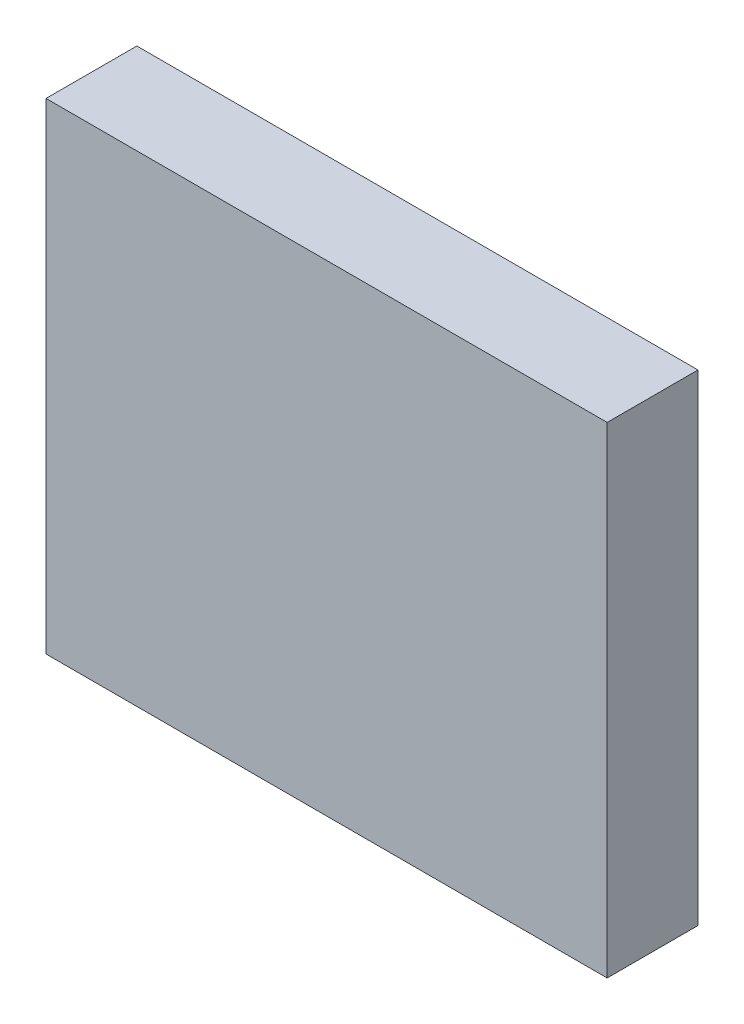
ISO-10303-21;
HEADER;
FILE_DESCRIPTION(('STEP AP214'),'2;1');
FILE_NAME('part.step','',(''),(''),'','','');
FILE_SCHEMA(('AUTOMOTIVE_DESIGN { 1 0 10303 214 1 1 1 1 }'));
ENDSEC;
DATA;
#1=APPLICATION_CONTEXT('core data for automotive mechanical design processes');
#2=APPLICATION_PROTOCOL_DEFINITION('international standard','automotive_design',2000,#1);
#3=PRODUCT_CONTEXT('',#1,'mechanical');
#4=PRODUCT('Part','Part','',(#3));
#5=PRODUCT_RELATED_PRODUCT_CATEGORY('part','',(#4));
#6=PRODUCT_DEFINITION_FORMATION('','',#4);
#7=PRODUCT_DEFINITION_CONTEXT('part definition',#1,'design');
#8=PRODUCT_DEFINITION('design','',#6,#7);
#9=PRODUCT_DEFINITION_SHAPE('','',#8);
#10=(LENGTH_UNIT() NAMED_UNIT(*) SI_UNIT(.MILLI.,.METRE.));
#11=(NAMED_UNIT(*) PLANE_ANGLE_UNIT() SI_UNIT($,.RADIAN.));
#12=(NAMED_UNIT(*) SI_UNIT($,.STERADIAN.) SOLID_ANGLE_UNIT());
#13=UNCERTAINTY_MEASURE_WITH_UNIT(LENGTH_MEASURE(1.E-05),#10,'distance_accuracy_value','');
#14=(GEOMETRIC_REPRESENTATION_CONTEXT(3) GLOBAL_UNCERTAINTY_ASSIGNED_CONTEXT((#13)) GLOBAL_UNIT_ASSIGNED_CONTEXT((#10,
#11,#12)) REPRESENTATION_CONTEXT('',''));
#15=CARTESIAN_POINT('',(0.,0.,0.));
#16=DIRECTION('',(0.,0.,1.));
#17=DIRECTION('',(1.,0.,0.));
#18=AXIS2_PLACEMENT_3D('',#15,#16,#17);
#19=CARTESIAN_POINT('',(30.8960242944191,26.4925273821084,5.));
#20=DIRECTION('',(-1.,0.,0.));
#21=DIRECTION('',(0.,0.,1.));
#22=AXIS2_PLACEMENT_3D('',#19,#20,#21);
#23=PLANE('',#22);
#24=DIRECTION('',(0.,1.,0.));
#25=VECTOR('',#24,1.);
#26=CARTESIAN_POINT('',(30.8960242944191,26.4925273821084,-5.));
#27=LINE('',#26,#25);
#28=CARTESIAN_POINT('',(30.8960242944191,-26.4925273821084,-5.));
#29=VERTEX_POINT('',#28);
#30=CARTESIAN_POINT('',(30.8960242944191,26.4925273821084,-5.));
#31=VERTEX_POINT('',#30);
#32=EDGE_CURVE('E98',#29,#31,#27,.T.);
#33=ORIENTED_EDGE('',*,*,#32,.T.);
#34=DIRECTION('',(0.,0.,-1.));
#35=VECTOR('',#34,1.);
#36=CARTESIAN_POINT('',(30.8960242944191,26.4925273821084,5.));
#37=LINE('',#36,#35);
#38=CARTESIAN_POINT('',(30.8960242944191,26.4925273821084,5.));
#39=VERTEX_POINT('',#38);
#40=EDGE_CURVE('E11',#39,#31,#37,.T.);
#41=ORIENTED_EDGE('',*,*,#40,.F.);
#42=DIRECTION('',(0.,1.,0.));
#43=VECTOR('',#42,1.);
#44=CARTESIAN_POINT('',(30.8960242944191,26.4925273821084,5.));
#45=LINE('',#44,#43);
#46=CARTESIAN_POINT('',(30.8960242944191,-26.4925273821084,5.));
#47=VERTEX_POINT('',#46);
#48=EDGE_CURVE('E86',#47,#39,#45,.T.);
#49=ORIENTED_EDGE('',*,*,#48,.F.);
#50=DIRECTION('',(0.,0.,-1.));
#51=VECTOR('',#50,1.);
#52=CARTESIAN_POINT('',(30.8960242944191,-26.4925273821084,5.));
#53=LINE('',#52,#51);
#54=EDGE_CURVE('E94',#47,#29,#53,.T.);
#55=ORIENTED_EDGE('',*,*,#54,.T.);
#56=EDGE_LOOP('',(#33,#41,#49,#55));
#57=FACE_BOUND('',#56,.T.);
#58=ADVANCED_FACE('F35',(#57),#23,.F.);
#59=CARTESIAN_POINT('',(-30.8960242944191,26.4925273821084,5.));
#60=DIRECTION('',(0.,-1.,0.));
#61=DIRECTION('',(0.,0.,-1.));
#62=AXIS2_PLACEMENT_3D('',#59,#60,#61);
#63=PLANE('',#62);
#64=DIRECTION('',(-1.,0.,0.));
#65=VECTOR('',#64,1.);
#66=CARTESIAN_POINT('',(-30.8960242944191,26.4925273821084,-5.));
#67=LINE('',#66,#65);
#68=CARTESIAN_POINT('',(-30.8960242944191,26.4925273821084,-5.));
#69=VERTEX_POINT('',#68);
#70=EDGE_CURVE('E90',#31,#69,#67,.T.);
#71=ORIENTED_EDGE('',*,*,#70,.T.);
#72=DIRECTION('',(0.,0.,-1.));
#73=VECTOR('',#72,1.);
#74=CARTESIAN_POINT('',(-30.8960242944191,26.4925273821084,5.));
#75=LINE('',#74,#73);
#76=CARTESIAN_POINT('',(-30.8960242944191,26.4925273821084,5.));
#77=VERTEX_POINT('',#76);
#78=EDGE_CURVE('E43',#77,#69,#75,.T.);
#79=ORIENTED_EDGE('',*,*,#78,.F.);
#80=DIRECTION('',(-1.,0.,0.));
#81=VECTOR('',#80,1.);
#82=CARTESIAN_POINT('',(-30.8960242944191,26.4925273821084,5.));
#83=LINE('',#82,#81);
#84=EDGE_CURVE('E81',#39,#77,#83,.T.);
#85=ORIENTED_EDGE('',*,*,#84,.F.);
#86=ORIENTED_EDGE('',*,*,#40,.T.);
#87=EDGE_LOOP('',(#71,#79,#85,#86));
#88=FACE_BOUND('',#87,.T.);
#89=ADVANCED_FACE('F89',(#88),#63,.F.);
#90=CARTESIAN_POINT('',(-30.8960242944191,26.4925273821084,5.));
#91=DIRECTION('',(1.,0.,0.));
#92=DIRECTION('',(0.,0.,-1.));
#93=AXIS2_PLACEMENT_3D('',#90,#91,#92);
#94=PLANE('',#93);
#95=DIRECTION('',(0.,-1.,0.));
#96=VECTOR('',#95,1.);
#97=CARTESIAN_POINT('',(-30.8960242944191,26.4925273821084,-5.));
#98=LINE('',#97,#96);
#99=CARTESIAN_POINT('',(-30.8960242944191,-26.4925273821084,-5.));
#100=VERTEX_POINT('',#99);
#101=EDGE_CURVE('E68',#69,#100,#98,.T.);
#102=ORIENTED_EDGE('',*,*,#101,.T.);
#103=DIRECTION('',(0.,0.,-1.));
#104=VECTOR('',#103,1.);
#105=CARTESIAN_POINT('',(-30.8960242944191,-26.4925273821084,5.));
#106=LINE('',#105,#104);
#107=CARTESIAN_POINT('',(-30.8960242944191,-26.4925273821084,5.));
#108=VERTEX_POINT('',#107);
#109=EDGE_CURVE('E91',#108,#100,#106,.T.);
#110=ORIENTED_EDGE('',*,*,#109,.F.);
#111=DIRECTION('',(0.,-1.,0.));
#112=VECTOR('',#111,1.);
#113=CARTESIAN_POINT('',(-30.8960242944191,26.4925273821084,5.));
#114=LINE('',#113,#112);
#115=EDGE_CURVE('E84',#77,#108,#114,.T.);
#116=ORIENTED_EDGE('',*,*,#115,.F.);
#117=ORIENTED_EDGE('',*,*,#78,.T.);
#118=EDGE_LOOP('',(#102,#110,#116,#117));
#119=FACE_BOUND('',#118,.T.);
#120=ADVANCED_FACE('F92',(#119),#94,.F.);
#121=CARTESIAN_POINT('',(-30.8960242944191,-26.4925273821084,5.));
#122=DIRECTION('',(0.,1.,0.));
#123=DIRECTION('',(0.,0.,1.));
#124=AXIS2_PLACEMENT_3D('',#121,#122,#123);
#125=PLANE('',#124);
#126=DIRECTION('',(1.,0.,0.));
#127=VECTOR('',#126,1.);
#128=CARTESIAN_POINT('',(-30.8960242944191,-26.4925273821084,-5.));
#129=LINE('',#128,#127);
#130=EDGE_CURVE('E74',#100,#29,#129,.T.);
#131=ORIENTED_EDGE('',*,*,#130,.T.);
#132=ORIENTED_EDGE('',*,*,#54,.F.);
#133=DIRECTION('',(1.,0.,0.));
#134=VECTOR('',#133,1.);
#135=CARTESIAN_POINT('',(-30.8960242944191,-26.4925273821084,5.));
#136=LINE('',#135,#134);
#137=EDGE_CURVE('E51',#108,#47,#136,.T.);
#138=ORIENTED_EDGE('',*,*,#137,.F.);
#139=ORIENTED_EDGE('',*,*,#109,.T.);
#140=EDGE_LOOP('',(#131,#132,#138,#139));
#141=FACE_BOUND('',#140,.T.);
#142=ADVANCED_FACE('F105',(#141),#125,.F.);
#143=CARTESIAN_POINT('',(0.,0.,5.));
#144=DIRECTION('',(0.,0.,1.));
#145=DIRECTION('',(1.,0.,0.));
#146=AXIS2_PLACEMENT_3D('',#143,#144,#145);
#147=PLANE('',#146);
#148=ORIENTED_EDGE('',*,*,#48,.T.);
#149=ORIENTED_EDGE('',*,*,#84,.T.);
#150=ORIENTED_EDGE('',*,*,#115,.T.);
#151=ORIENTED_EDGE('',*,*,#137,.T.);
#152=EDGE_LOOP('',(#148,#149,#150,#151));
#153=FACE_BOUND('',#152,.T.);
#154=ADVANCED_FACE('F82',(#153),#147,.T.);
#155=CARTESIAN_POINT('',(0.,0.,-5.));
#156=DIRECTION('',(0.,0.,1.));
#157=DIRECTION('',(1.,0.,0.));
#158=AXIS2_PLACEMENT_3D('',#155,#156,#157);
#159=PLANE('',#158);
#160=ORIENTED_EDGE('',*,*,#32,.F.);
#161=ORIENTED_EDGE('',*,*,#130,.F.);
#162=ORIENTED_EDGE('',*,*,#101,.F.);
#163=ORIENTED_EDGE('',*,*,#70,.F.);
#164=EDGE_LOOP('',(#160,#161,#162,#163));
#165=FACE_BOUND('',#164,.T.);
#166=ADVANCED_FACE('F108',(#165),#159,.F.);
#167=CLOSED_SHELL('',(#58,#89,#120,#142,#154,#166));
#168=MANIFOLD_SOLID_BREP('B2',#167);
#169=ADVANCED_BREP_SHAPE_REPRESENTATION('',(#18,#168),#14);
#170=SHAPE_DEFINITION_REPRESENTATION(#9,#169);
ENDSEC;
END-ISO-10303-21;
